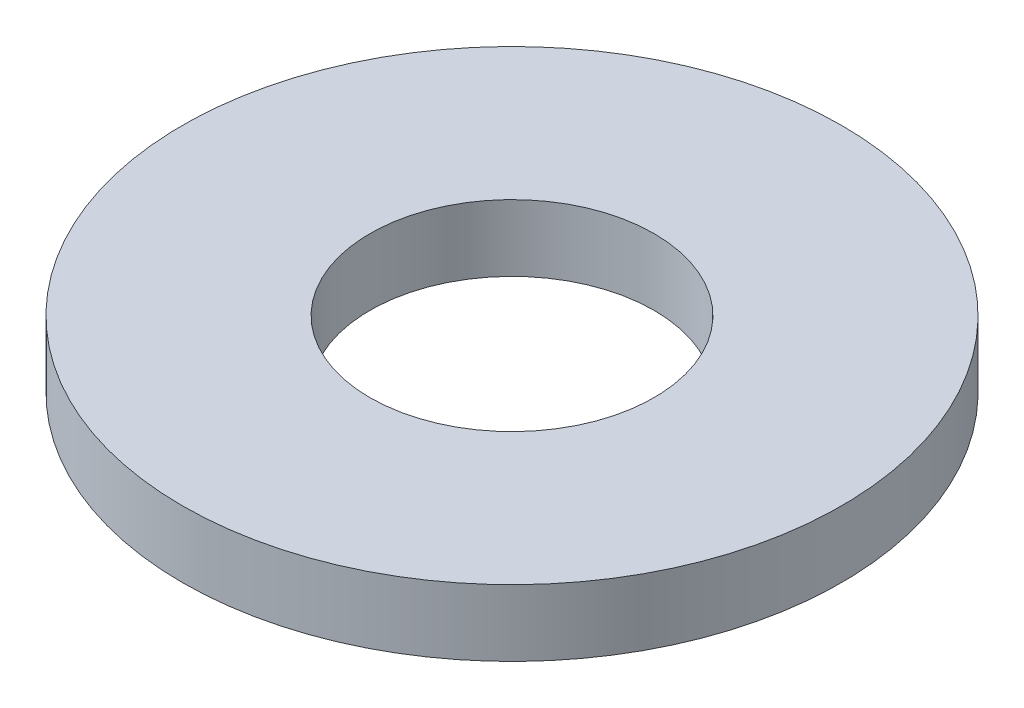
ISO-10303-21;
HEADER;
FILE_DESCRIPTION(('STEP AP214'),'2;1');
FILE_NAME('part.step','',(''),(''),'','','');
FILE_SCHEMA(('AUTOMOTIVE_DESIGN { 1 0 10303 214 1 1 1 1 }'));
ENDSEC;
DATA;
#1=APPLICATION_CONTEXT('core data for automotive mechanical design processes');
#2=APPLICATION_PROTOCOL_DEFINITION('international standard','automotive_design',2000,#1);
#3=PRODUCT_CONTEXT('',#1,'mechanical');
#4=PRODUCT('Part','Part','',(#3));
#5=PRODUCT_RELATED_PRODUCT_CATEGORY('part','',(#4));
#6=PRODUCT_DEFINITION_FORMATION('','',#4);
#7=PRODUCT_DEFINITION_CONTEXT('part definition',#1,'design');
#8=PRODUCT_DEFINITION('design','',#6,#7);
#9=PRODUCT_DEFINITION_SHAPE('','',#8);
#10=(LENGTH_UNIT() NAMED_UNIT(*) SI_UNIT(.MILLI.,.METRE.));
#11=(NAMED_UNIT(*) PLANE_ANGLE_UNIT() SI_UNIT($,.RADIAN.));
#12=(NAMED_UNIT(*) SI_UNIT($,.STERADIAN.) SOLID_ANGLE_UNIT());
#13=UNCERTAINTY_MEASURE_WITH_UNIT(LENGTH_MEASURE(1.E-05),#10,'distance_accuracy_value','');
#14=(GEOMETRIC_REPRESENTATION_CONTEXT(3) GLOBAL_UNCERTAINTY_ASSIGNED_CONTEXT((#13)) GLOBAL_UNIT_ASSIGNED_CONTEXT((#10,
#11,#12)) REPRESENTATION_CONTEXT('',''));
#15=CARTESIAN_POINT('',(0.,0.,0.));
#16=DIRECTION('',(0.,0.,1.));
#17=DIRECTION('',(1.,0.,0.));
#18=AXIS2_PLACEMENT_3D('',#15,#16,#17);
#19=CARTESIAN_POINT('',(0.,0.5588,0.));
#20=DIRECTION('',(0.,-1.,0.));
#21=DIRECTION('',(0.,0.,-1.));
#22=AXIS2_PLACEMENT_3D('',#19,#20,#21);
#23=CYLINDRICAL_SURFACE('',#22,2.7686);
#24=CARTESIAN_POINT('',(0.,0.5588,0.));
#25=DIRECTION('',(0.,1.,0.));
#26=DIRECTION('',(0.,0.,1.));
#27=AXIS2_PLACEMENT_3D('',#24,#25,#26);
#28=CIRCLE('',#27,2.7686);
#29=CARTESIAN_POINT('',(0.,0.5588,2.7686));
#30=VERTEX_POINT('',#29);
#31=EDGE_CURVE('E10',#30,#30,#28,.T.);
#32=ORIENTED_EDGE('',*,*,#31,.F.);
#33=EDGE_LOOP('',(#32));
#34=FACE_BOUND('',#33,.T.);
#35=CARTESIAN_POINT('',(0.,0.,0.));
#36=DIRECTION('',(0.,1.,0.));
#37=DIRECTION('',(0.,0.,1.));
#38=AXIS2_PLACEMENT_3D('',#35,#36,#37);
#39=CIRCLE('',#38,2.7686);
#40=CARTESIAN_POINT('',(0.,0.,2.7686));
#41=VERTEX_POINT('',#40);
#42=EDGE_CURVE('E32',#41,#41,#39,.T.);
#43=ORIENTED_EDGE('',*,*,#42,.T.);
#44=EDGE_LOOP('',(#43));
#45=FACE_BOUND('',#44,.T.);
#46=ADVANCED_FACE('F29',(#34,#45),#23,.T.);
#47=CARTESIAN_POINT('',(0.,0.5588,0.));
#48=DIRECTION('',(0.,1.,0.));
#49=DIRECTION('',(0.,0.,1.));
#50=AXIS2_PLACEMENT_3D('',#47,#48,#49);
#51=PLANE('',#50);
#52=CARTESIAN_POINT('',(0.,0.5588,0.));
#53=DIRECTION('',(0.,1.,0.));
#54=DIRECTION('',(0.,0.,1.));
#55=AXIS2_PLACEMENT_3D('',#52,#53,#54);
#56=CIRCLE('',#55,1.1938);
#57=CARTESIAN_POINT('',(0.,0.5588,1.1938));
#58=VERTEX_POINT('',#57);
#59=EDGE_CURVE('E41',#58,#58,#56,.T.);
#60=ORIENTED_EDGE('',*,*,#59,.F.);
#61=EDGE_LOOP('',(#60));
#62=FACE_BOUND('',#61,.T.);
#63=ORIENTED_EDGE('',*,*,#31,.T.);
#64=EDGE_LOOP('',(#63));
#65=FACE_BOUND('',#64,.T.);
#66=ADVANCED_FACE('F56',(#62,#65),#51,.T.);
#67=CARTESIAN_POINT('',(0.,0.,0.));
#68=DIRECTION('',(0.,1.,0.));
#69=DIRECTION('',(0.,0.,1.));
#70=AXIS2_PLACEMENT_3D('',#67,#68,#69);
#71=PLANE('',#70);
#72=CARTESIAN_POINT('',(0.,0.,0.));
#73=DIRECTION('',(0.,1.,0.));
#74=DIRECTION('',(0.,0.,1.));
#75=AXIS2_PLACEMENT_3D('',#72,#73,#74);
#76=CIRCLE('',#75,1.1938);
#77=CARTESIAN_POINT('',(0.,0.,1.1938));
#78=VERTEX_POINT('',#77);
#79=EDGE_CURVE('E39',#78,#78,#76,.T.);
#80=ORIENTED_EDGE('',*,*,#79,.T.);
#81=EDGE_LOOP('',(#80));
#82=FACE_BOUND('',#81,.T.);
#83=ORIENTED_EDGE('',*,*,#42,.F.);
#84=EDGE_LOOP('',(#83));
#85=FACE_BOUND('',#84,.T.);
#86=ADVANCED_FACE('F47',(#82,#85),#71,.F.);
#87=CARTESIAN_POINT('',(0.,0.,0.));
#88=DIRECTION('',(0.,1.,0.));
#89=DIRECTION('',(0.,0.,1.));
#90=AXIS2_PLACEMENT_3D('',#87,#88,#89);
#91=CYLINDRICAL_SURFACE('',#90,1.1938);
#92=ORIENTED_EDGE('',*,*,#79,.F.);
#93=EDGE_LOOP('',(#92));
#94=FACE_BOUND('',#93,.T.);
#95=ORIENTED_EDGE('',*,*,#59,.T.);
#96=EDGE_LOOP('',(#95));
#97=FACE_BOUND('',#96,.T.);
#98=ADVANCED_FACE('F50',(#94,#97),#91,.F.);
#99=CLOSED_SHELL('',(#46,#66,#86,#98));
#100=MANIFOLD_SOLID_BREP('B2',#99);
#101=ADVANCED_BREP_SHAPE_REPRESENTATION('',(#18,#100),#14);
#102=SHAPE_DEFINITION_REPRESENTATION(#9,#101);
ENDSEC;
END-ISO-10303-21;
